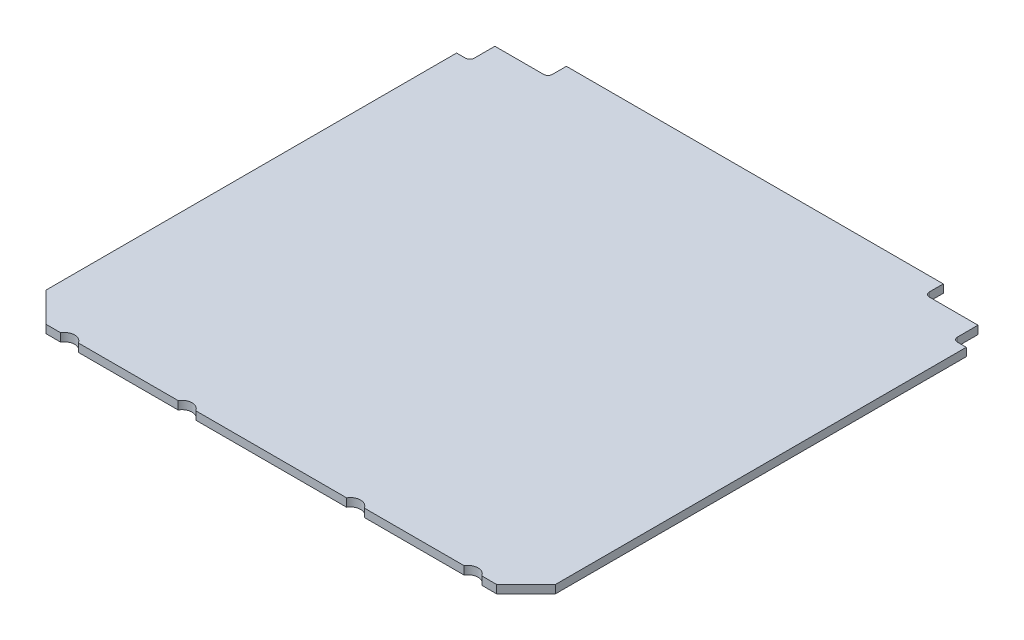
ISO-10303-21;
HEADER;
FILE_DESCRIPTION(('STEP AP214'),'2;1');
FILE_NAME('part.step','',(''),(''),'','','');
FILE_SCHEMA(('AUTOMOTIVE_DESIGN { 1 0 10303 214 1 1 1 1 }'));
ENDSEC;
DATA;
#1=APPLICATION_CONTEXT('core data for automotive mechanical design processes');
#2=APPLICATION_PROTOCOL_DEFINITION('international standard','automotive_design',2000,#1);
#3=PRODUCT_CONTEXT('',#1,'mechanical');
#4=PRODUCT('Part','Part','',(#3));
#5=PRODUCT_RELATED_PRODUCT_CATEGORY('part','',(#4));
#6=PRODUCT_DEFINITION_FORMATION('','',#4);
#7=PRODUCT_DEFINITION_CONTEXT('part definition',#1,'design');
#8=PRODUCT_DEFINITION('design','',#6,#7);
#9=PRODUCT_DEFINITION_SHAPE('','',#8);
#10=(LENGTH_UNIT() NAMED_UNIT(*) SI_UNIT(.MILLI.,.METRE.));
#11=(NAMED_UNIT(*) PLANE_ANGLE_UNIT() SI_UNIT($,.RADIAN.));
#12=(NAMED_UNIT(*) SI_UNIT($,.STERADIAN.) SOLID_ANGLE_UNIT());
#13=UNCERTAINTY_MEASURE_WITH_UNIT(LENGTH_MEASURE(1.E-05),#10,'distance_accuracy_value','');
#14=(GEOMETRIC_REPRESENTATION_CONTEXT(3) GLOBAL_UNCERTAINTY_ASSIGNED_CONTEXT((#13)) GLOBAL_UNIT_ASSIGNED_CONTEXT((#10,
#11,#12)) REPRESENTATION_CONTEXT('',''));
#15=CARTESIAN_POINT('',(0.,0.,0.));
#16=DIRECTION('',(0.,0.,1.));
#17=DIRECTION('',(1.,0.,0.));
#18=AXIS2_PLACEMENT_3D('',#15,#16,#17);
#19=CARTESIAN_POINT('',(44.4499999999995,0.8,44.4499999999995));
#20=DIRECTION('',(-0.707106781186548,0.,-0.707106781186548));
#21=DIRECTION('',(-0.707106781186548,0.,0.707106781186548));
#22=AXIS2_PLACEMENT_3D('',#19,#20,#21);
#23=PLANE('',#22);
#24=DIRECTION('',(0.,1.,0.));
#25=VECTOR('',#24,1.);
#26=CARTESIAN_POINT('',(44.0999999999991,-0.8,44.8));
#27=LINE('',#26,#25);
#28=CARTESIAN_POINT('',(44.0999999999991,-0.8,44.8));
#29=VERTEX_POINT('',#28);
#30=CARTESIAN_POINT('',(44.0999999999991,0.8,44.8));
#31=VERTEX_POINT('',#30);
#32=EDGE_CURVE('E228',#29,#31,#27,.T.);
#33=ORIENTED_EDGE('',*,*,#32,.F.);
#34=DIRECTION('',(0.707106781186548,0.,-0.707106781186548));
#35=VECTOR('',#34,1.);
#36=CARTESIAN_POINT('',(44.4499999999995,-0.8,44.4499999999995));
#37=LINE('',#36,#35);
#38=CARTESIAN_POINT('',(49.9000000000001,-0.8,38.999999999999));
#39=VERTEX_POINT('',#38);
#40=EDGE_CURVE('E244',#29,#39,#37,.T.);
#41=ORIENTED_EDGE('',*,*,#40,.T.);
#42=DIRECTION('',(0.,1.,0.));
#43=VECTOR('',#42,1.);
#44=CARTESIAN_POINT('',(49.9000000000001,-0.8,38.999999999999));
#45=LINE('',#44,#43);
#46=CARTESIAN_POINT('',(49.9000000000001,0.8,38.999999999999));
#47=VERTEX_POINT('',#46);
#48=EDGE_CURVE('E246',#39,#47,#45,.T.);
#49=ORIENTED_EDGE('',*,*,#48,.T.);
#50=DIRECTION('',(0.707106781186548,0.,-0.707106781186548));
#51=VECTOR('',#50,1.);
#52=CARTESIAN_POINT('',(44.4499999999995,0.8,44.4499999999995));
#53=LINE('',#52,#51);
#54=EDGE_CURVE('E236',#31,#47,#53,.T.);
#55=ORIENTED_EDGE('',*,*,#54,.F.);
#56=EDGE_LOOP('',(#33,#41,#49,#55));
#57=FACE_BOUND('',#56,.T.);
#58=ADVANCED_FACE('F38',(#57),#23,.F.);
#59=CARTESIAN_POINT('',(-44.4499999999997,0.8,44.4500000000004));
#60=DIRECTION('',(0.707106781186542,0.,-0.707106781186553));
#61=DIRECTION('',(-0.707106781186553,0.,-0.707106781186542));
#62=AXIS2_PLACEMENT_3D('',#59,#60,#61);
#63=PLANE('',#62);
#64=DIRECTION('',(0.,1.,0.));
#65=VECTOR('',#64,1.);
#66=CARTESIAN_POINT('',(-44.1000000000001,-0.8,44.8));
#67=LINE('',#66,#65);
#68=CARTESIAN_POINT('',(-44.1000000000001,-0.8,44.8));
#69=VERTEX_POINT('',#68);
#70=CARTESIAN_POINT('',(-44.1000000000001,0.8,44.8));
#71=VERTEX_POINT('',#70);
#72=EDGE_CURVE('E211',#69,#71,#67,.T.);
#73=ORIENTED_EDGE('',*,*,#72,.T.);
#74=DIRECTION('',(0.707106781186553,0.,0.707106781186542));
#75=VECTOR('',#74,1.);
#76=CARTESIAN_POINT('',(-44.4499999999997,0.8,44.4500000000004));
#77=LINE('',#76,#75);
#78=CARTESIAN_POINT('',(-49.9000000000001,0.8,39.));
#79=VERTEX_POINT('',#78);
#80=EDGE_CURVE('E225',#79,#71,#77,.T.);
#81=ORIENTED_EDGE('',*,*,#80,.F.);
#82=DIRECTION('',(0.,1.,0.));
#83=VECTOR('',#82,1.);
#84=CARTESIAN_POINT('',(-49.9000000000001,-0.8,39.));
#85=LINE('',#84,#83);
#86=CARTESIAN_POINT('',(-49.9000000000001,-0.8,39.));
#87=VERTEX_POINT('',#86);
#88=EDGE_CURVE('E341',#87,#79,#85,.T.);
#89=ORIENTED_EDGE('',*,*,#88,.F.);
#90=DIRECTION('',(0.707106781186553,0.,0.707106781186542));
#91=VECTOR('',#90,1.);
#92=CARTESIAN_POINT('',(-44.4499999999997,-0.8,44.4500000000004));
#93=LINE('',#92,#91);
#94=EDGE_CURVE('E227',#87,#69,#93,.T.);
#95=ORIENTED_EDGE('',*,*,#94,.T.);
#96=EDGE_LOOP('',(#73,#81,#89,#95));
#97=FACE_BOUND('',#96,.T.);
#98=ADVANCED_FACE('F223',(#97),#63,.F.);
#99=CARTESIAN_POINT('',(0.,0.8,0.));
#100=DIRECTION('',(0.,1.,0.));
#101=DIRECTION('',(0.,0.,1.));
#102=AXIS2_PLACEMENT_3D('',#99,#100,#101);
#103=PLANE('',#102);
#104=ORIENTED_EDGE('',*,*,#80,.T.);
#105=DIRECTION('',(1.,0.,0.));
#106=VECTOR('',#105,1.);
#107=CARTESIAN_POINT('',(0.,0.8,44.8));
#108=LINE('',#107,#106);
#109=CARTESIAN_POINT('',(-41.2320508075689,0.8,44.8));
#110=VERTEX_POINT('',#109);
#111=EDGE_CURVE('E208',#71,#110,#108,.T.);
#112=ORIENTED_EDGE('',*,*,#111,.T.);
#113=CARTESIAN_POINT('',(-39.5,0.8,45.8));
#114=DIRECTION('',(0.,1.,0.));
#115=DIRECTION('',(0.,0.,1.));
#116=AXIS2_PLACEMENT_3D('',#113,#114,#115);
#117=CIRCLE('',#116,2.);
#118=CARTESIAN_POINT('',(-37.7679491924311,0.8,44.8));
#119=VERTEX_POINT('',#118);
#120=EDGE_CURVE('E365',#119,#110,#117,.T.);
#121=ORIENTED_EDGE('',*,*,#120,.F.);
#122=DIRECTION('',(1.,0.,0.));
#123=VECTOR('',#122,1.);
#124=CARTESIAN_POINT('',(0.,0.8,44.8));
#125=LINE('',#124,#123);
#126=CARTESIAN_POINT('',(-18.2320508075689,0.8,44.8));
#127=VERTEX_POINT('',#126);
#128=EDGE_CURVE('E369',#119,#127,#125,.T.);
#129=ORIENTED_EDGE('',*,*,#128,.T.);
#130=CARTESIAN_POINT('',(-16.5,0.8,45.8));
#131=DIRECTION('',(0.,1.,0.));
#132=DIRECTION('',(0.,0.,1.));
#133=AXIS2_PLACEMENT_3D('',#130,#131,#132);
#134=CIRCLE('',#133,2.);
#135=CARTESIAN_POINT('',(-14.7679491924311,0.8,44.8));
#136=VERTEX_POINT('',#135);
#137=EDGE_CURVE('E503',#136,#127,#134,.T.);
#138=ORIENTED_EDGE('',*,*,#137,.F.);
#139=DIRECTION('',(1.,0.,0.));
#140=VECTOR('',#139,1.);
#141=CARTESIAN_POINT('',(0.,0.8,44.8));
#142=LINE('',#141,#140);
#143=CARTESIAN_POINT('',(14.7679491924311,0.8,44.8));
#144=VERTEX_POINT('',#143);
#145=EDGE_CURVE('E500',#136,#144,#142,.T.);
#146=ORIENTED_EDGE('',*,*,#145,.T.);
#147=CARTESIAN_POINT('',(16.5,0.8,45.8));
#148=DIRECTION('',(0.,1.,0.));
#149=DIRECTION('',(0.,0.,1.));
#150=AXIS2_PLACEMENT_3D('',#147,#148,#149);
#151=CIRCLE('',#150,2.);
#152=CARTESIAN_POINT('',(18.2320508075689,0.8,44.8));
#153=VERTEX_POINT('',#152);
#154=EDGE_CURVE('E497',#153,#144,#151,.T.);
#155=ORIENTED_EDGE('',*,*,#154,.F.);
#156=DIRECTION('',(1.,0.,0.));
#157=VECTOR('',#156,1.);
#158=CARTESIAN_POINT('',(0.,0.8,44.8));
#159=LINE('',#158,#157);
#160=CARTESIAN_POINT('',(37.7679491924311,0.8,44.8));
#161=VERTEX_POINT('',#160);
#162=EDGE_CURVE('E493',#153,#161,#159,.T.);
#163=ORIENTED_EDGE('',*,*,#162,.T.);
#164=CARTESIAN_POINT('',(39.5,0.8,45.8));
#165=DIRECTION('',(0.,1.,0.));
#166=DIRECTION('',(0.,0.,1.));
#167=AXIS2_PLACEMENT_3D('',#164,#165,#166);
#168=CIRCLE('',#167,2.);
#169=CARTESIAN_POINT('',(41.2320508075689,0.8,44.8));
#170=VERTEX_POINT('',#169);
#171=EDGE_CURVE('E491',#170,#161,#168,.T.);
#172=ORIENTED_EDGE('',*,*,#171,.F.);
#173=DIRECTION('',(1.,0.,0.));
#174=VECTOR('',#173,1.);
#175=CARTESIAN_POINT('',(0.,0.8,44.8));
#176=LINE('',#175,#174);
#177=EDGE_CURVE('E218',#170,#31,#176,.T.);
#178=ORIENTED_EDGE('',*,*,#177,.T.);
#179=ORIENTED_EDGE('',*,*,#54,.T.);
#180=DIRECTION('',(0.,0.,-1.));
#181=VECTOR('',#180,1.);
#182=CARTESIAN_POINT('',(49.9000000000001,0.8,0.));
#183=LINE('',#182,#181);
#184=CARTESIAN_POINT('',(49.9000000000001,0.8,-41.4000000000031));
#185=VERTEX_POINT('',#184);
#186=EDGE_CURVE('E317',#47,#185,#183,.T.);
#187=ORIENTED_EDGE('',*,*,#186,.T.);
#188=DIRECTION('',(-1.,0.,0.));
#189=VECTOR('',#188,1.);
#190=CARTESIAN_POINT('',(0.,0.8,-41.4000000000031));
#191=LINE('',#190,#189);
#192=CARTESIAN_POINT('',(48.1635999999999,0.8,-41.4000000000031));
#193=VERTEX_POINT('',#192);
#194=EDGE_CURVE('E315',#185,#193,#191,.T.);
#195=ORIENTED_EDGE('',*,*,#194,.T.);
#196=CARTESIAN_POINT('',(48.1635999999999,0.8,-42.2636000000031));
#197=DIRECTION('',(0.,1.,0.));
#198=DIRECTION('',(0.,0.,1.));
#199=AXIS2_PLACEMENT_3D('',#196,#197,#198);
#200=CIRCLE('',#199,0.8636);
#201=CARTESIAN_POINT('',(47.2999999999999,0.8,-42.2636000000031));
#202=VERTEX_POINT('',#201);
#203=EDGE_CURVE('E46',#193,#202,#200,.F.);
#204=ORIENTED_EDGE('',*,*,#203,.T.);
#205=DIRECTION('',(0.,0.,-1.));
#206=VECTOR('',#205,1.);
#207=CARTESIAN_POINT('',(47.2999999999999,0.8,0.));
#208=LINE('',#207,#206);
#209=CARTESIAN_POINT('',(47.2999999999999,0.8,-46.3));
#210=VERTEX_POINT('',#209);
#211=EDGE_CURVE('E308',#202,#210,#208,.T.);
#212=ORIENTED_EDGE('',*,*,#211,.T.);
#213=DIRECTION('',(-1.,0.,0.));
#214=VECTOR('',#213,1.);
#215=CARTESIAN_POINT('',(0.,0.8,-46.3));
#216=LINE('',#215,#214);
#217=CARTESIAN_POINT('',(37.7635999999997,0.8,-46.3));
#218=VERTEX_POINT('',#217);
#219=EDGE_CURVE('E300',#210,#218,#216,.T.);
#220=ORIENTED_EDGE('',*,*,#219,.T.);
#221=CARTESIAN_POINT('',(37.7635999999997,0.8,-47.1636));
#222=DIRECTION('',(0.,1.,0.));
#223=DIRECTION('',(0.,0.,1.));
#224=AXIS2_PLACEMENT_3D('',#221,#222,#223);
#225=CIRCLE('',#224,0.8636);
#226=CARTESIAN_POINT('',(36.8999999999997,0.8,-47.1636));
#227=VERTEX_POINT('',#226);
#228=EDGE_CURVE('E271',#218,#227,#225,.F.);
#229=ORIENTED_EDGE('',*,*,#228,.T.);
#230=DIRECTION('',(0.,0.,-1.));
#231=VECTOR('',#230,1.);
#232=CARTESIAN_POINT('',(36.8999999999973,0.8,1.92033888790618E-12));
#233=LINE('',#232,#231);
#234=CARTESIAN_POINT('',(36.8999999999999,0.8,-49.9));
#235=VERTEX_POINT('',#234);
#236=EDGE_CURVE('E298',#227,#235,#233,.T.);
#237=ORIENTED_EDGE('',*,*,#236,.T.);
#238=DIRECTION('',(-1.,0.,0.));
#239=VECTOR('',#238,1.);
#240=CARTESIAN_POINT('',(0.,0.8,-49.9));
#241=LINE('',#240,#239);
#242=CARTESIAN_POINT('',(-36.9000000000002,0.8,-49.9));
#243=VERTEX_POINT('',#242);
#244=EDGE_CURVE('E306',#235,#243,#241,.T.);
#245=ORIENTED_EDGE('',*,*,#244,.T.);
#246=DIRECTION('',(0.,0.,1.));
#247=VECTOR('',#246,1.);
#248=CARTESIAN_POINT('',(-36.8999999999999,0.8,2.13370987545147E-13));
#249=LINE('',#248,#247);
#250=CARTESIAN_POINT('',(-36.9000000000002,0.8,-47.1636));
#251=VERTEX_POINT('',#250);
#252=EDGE_CURVE('E310',#243,#251,#249,.T.);
#253=ORIENTED_EDGE('',*,*,#252,.T.);
#254=CARTESIAN_POINT('',(-37.7636000000002,0.8,-47.1636));
#255=DIRECTION('',(0.,1.,0.));
#256=DIRECTION('',(0.,0.,1.));
#257=AXIS2_PLACEMENT_3D('',#254,#255,#256);
#258=CIRCLE('',#257,0.8636);
#259=CARTESIAN_POINT('',(-37.7636000000002,0.8,-46.3));
#260=VERTEX_POINT('',#259);
#261=EDGE_CURVE('E267',#251,#260,#258,.F.);
#262=ORIENTED_EDGE('',*,*,#261,.T.);
#263=DIRECTION('',(-1.,0.,0.));
#264=VECTOR('',#263,1.);
#265=CARTESIAN_POINT('',(0.,0.8,-46.3));
#266=LINE('',#265,#264);
#267=CARTESIAN_POINT('',(-47.3000000000002,0.8,-46.3));
#268=VERTEX_POINT('',#267);
#269=EDGE_CURVE('E410',#260,#268,#266,.T.);
#270=ORIENTED_EDGE('',*,*,#269,.T.);
#271=DIRECTION('',(0.,0.,1.));
#272=VECTOR('',#271,1.);
#273=CARTESIAN_POINT('',(-47.3000000000002,0.8,0.));
#274=LINE('',#273,#272);
#275=CARTESIAN_POINT('',(-47.3000000000002,0.8,-42.2636));
#276=VERTEX_POINT('',#275);
#277=EDGE_CURVE('E407',#268,#276,#274,.T.);
#278=ORIENTED_EDGE('',*,*,#277,.T.);
#279=CARTESIAN_POINT('',(-48.1636000000002,0.8,-42.2636));
#280=DIRECTION('',(0.,1.,0.));
#281=DIRECTION('',(0.,0.,1.));
#282=AXIS2_PLACEMENT_3D('',#279,#280,#281);
#283=CIRCLE('',#282,0.8636);
#284=CARTESIAN_POINT('',(-48.1636000000002,0.8,-41.4));
#285=VERTEX_POINT('',#284);
#286=EDGE_CURVE('E263',#276,#285,#283,.F.);
#287=ORIENTED_EDGE('',*,*,#286,.T.);
#288=DIRECTION('',(-1.,0.,0.));
#289=VECTOR('',#288,1.);
#290=CARTESIAN_POINT('',(1.10488541392987E-12,0.8,-41.3999999999987));
#291=LINE('',#290,#289);
#292=CARTESIAN_POINT('',(-49.9000000000001,0.8,-41.4000000000001));
#293=VERTEX_POINT('',#292);
#294=EDGE_CURVE('E405',#285,#293,#291,.T.);
#295=ORIENTED_EDGE('',*,*,#294,.T.);
#296=DIRECTION('',(0.,0.,1.));
#297=VECTOR('',#296,1.);
#298=CARTESIAN_POINT('',(-49.9000000000001,0.8,0.));
#299=LINE('',#298,#297);
#300=EDGE_CURVE('E234',#293,#79,#299,.T.);
#301=ORIENTED_EDGE('',*,*,#300,.T.);
#302=EDGE_LOOP('',(#104,#112,#121,#129,#138,#146,#155,#163,#172,#178,#179,#187,#195,#204,#212,
#220,#229,#237,#245,#253,#262,#270,#278,#287,#295,#301));
#303=FACE_BOUND('',#302,.T.);
#304=ADVANCED_FACE('F232',(#303),#103,.T.);
#305=CARTESIAN_POINT('',(0.,-0.8,0.));
#306=DIRECTION('',(0.,1.,0.));
#307=DIRECTION('',(0.,0.,1.));
#308=AXIS2_PLACEMENT_3D('',#305,#306,#307);
#309=PLANE('',#308);
#310=DIRECTION('',(1.,0.,0.));
#311=VECTOR('',#310,1.);
#312=CARTESIAN_POINT('',(0.,-0.8,44.8));
#313=LINE('',#312,#311);
#314=CARTESIAN_POINT('',(-41.2320508075689,-0.8,44.8));
#315=VERTEX_POINT('',#314);
#316=EDGE_CURVE('E361',#69,#315,#313,.T.);
#317=ORIENTED_EDGE('',*,*,#316,.F.);
#318=ORIENTED_EDGE('',*,*,#94,.F.);
#319=DIRECTION('',(0.,0.,1.));
#320=VECTOR('',#319,1.);
#321=CARTESIAN_POINT('',(-49.9000000000001,-0.8,0.));
#322=LINE('',#321,#320);
#323=CARTESIAN_POINT('',(-49.9000000000001,-0.8,-41.4000000000001));
#324=VERTEX_POINT('',#323);
#325=EDGE_CURVE('E320',#324,#87,#322,.T.);
#326=ORIENTED_EDGE('',*,*,#325,.F.);
#327=DIRECTION('',(-1.,0.,0.));
#328=VECTOR('',#327,1.);
#329=CARTESIAN_POINT('',(1.10488541392987E-12,-0.8,-41.3999999999987));
#330=LINE('',#329,#328);
#331=CARTESIAN_POINT('',(-48.1636000000002,-0.8,-41.4));
#332=VERTEX_POINT('',#331);
#333=EDGE_CURVE('E322',#332,#324,#330,.T.);
#334=ORIENTED_EDGE('',*,*,#333,.F.);
#335=CARTESIAN_POINT('',(-48.1636000000002,-0.8,-42.2636));
#336=DIRECTION('',(0.,1.,0.));
#337=DIRECTION('',(0.,0.,1.));
#338=AXIS2_PLACEMENT_3D('',#335,#336,#337);
#339=CIRCLE('',#338,0.8636);
#340=CARTESIAN_POINT('',(-47.3000000000002,-0.8,-42.2636));
#341=VERTEX_POINT('',#340);
#342=EDGE_CURVE('E265',#332,#341,#339,.T.);
#343=ORIENTED_EDGE('',*,*,#342,.T.);
#344=DIRECTION('',(0.,0.,1.));
#345=VECTOR('',#344,1.);
#346=CARTESIAN_POINT('',(-47.3000000000002,-0.8,0.));
#347=LINE('',#346,#345);
#348=CARTESIAN_POINT('',(-47.3000000000002,-0.8,-46.3));
#349=VERTEX_POINT('',#348);
#350=EDGE_CURVE('E324',#349,#341,#347,.T.);
#351=ORIENTED_EDGE('',*,*,#350,.F.);
#352=DIRECTION('',(-1.,0.,0.));
#353=VECTOR('',#352,1.);
#354=CARTESIAN_POINT('',(0.,-0.8,-46.3));
#355=LINE('',#354,#353);
#356=CARTESIAN_POINT('',(-37.7636000000002,-0.8,-46.3));
#357=VERTEX_POINT('',#356);
#358=EDGE_CURVE('E327',#357,#349,#355,.T.);
#359=ORIENTED_EDGE('',*,*,#358,.F.);
#360=CARTESIAN_POINT('',(-37.7636000000002,-0.8,-47.1636));
#361=DIRECTION('',(0.,1.,0.));
#362=DIRECTION('',(0.,0.,1.));
#363=AXIS2_PLACEMENT_3D('',#360,#361,#362);
#364=CIRCLE('',#363,0.8636);
#365=CARTESIAN_POINT('',(-36.9000000000002,-0.8,-47.1636));
#366=VERTEX_POINT('',#365);
#367=EDGE_CURVE('E269',#357,#366,#364,.T.);
#368=ORIENTED_EDGE('',*,*,#367,.T.);
#369=DIRECTION('',(0.,0.,1.));
#370=VECTOR('',#369,1.);
#371=CARTESIAN_POINT('',(-36.8999999999999,-0.8,2.13370987545147E-13));
#372=LINE('',#371,#370);
#373=CARTESIAN_POINT('',(-36.9000000000002,-0.8,-49.9));
#374=VERTEX_POINT('',#373);
#375=EDGE_CURVE('E329',#374,#366,#372,.T.);
#376=ORIENTED_EDGE('',*,*,#375,.F.);
#377=DIRECTION('',(-1.,0.,0.));
#378=VECTOR('',#377,1.);
#379=CARTESIAN_POINT('',(0.,-0.8,-49.9));
#380=LINE('',#379,#378);
#381=CARTESIAN_POINT('',(36.8999999999999,-0.8,-49.9));
#382=VERTEX_POINT('',#381);
#383=EDGE_CURVE('E332',#382,#374,#380,.T.);
#384=ORIENTED_EDGE('',*,*,#383,.F.);
#385=DIRECTION('',(0.,0.,-1.));
#386=VECTOR('',#385,1.);
#387=CARTESIAN_POINT('',(36.8999999999973,-0.8,1.92033888790618E-12));
#388=LINE('',#387,#386);
#389=CARTESIAN_POINT('',(36.8999999999997,-0.8,-47.1636));
#390=VERTEX_POINT('',#389);
#391=EDGE_CURVE('E282',#390,#382,#388,.T.);
#392=ORIENTED_EDGE('',*,*,#391,.F.);
#393=CARTESIAN_POINT('',(37.7635999999997,-0.8,-47.1636));
#394=DIRECTION('',(0.,1.,0.));
#395=DIRECTION('',(0.,0.,1.));
#396=AXIS2_PLACEMENT_3D('',#393,#394,#395);
#397=CIRCLE('',#396,0.8636);
#398=CARTESIAN_POINT('',(37.7635999999997,-0.8,-46.3));
#399=VERTEX_POINT('',#398);
#400=EDGE_CURVE('E273',#390,#399,#397,.T.);
#401=ORIENTED_EDGE('',*,*,#400,.T.);
#402=DIRECTION('',(-1.,0.,0.));
#403=VECTOR('',#402,1.);
#404=CARTESIAN_POINT('',(0.,-0.8,-46.3));
#405=LINE('',#404,#403);
#406=CARTESIAN_POINT('',(47.2999999999999,-0.8,-46.3));
#407=VERTEX_POINT('',#406);
#408=EDGE_CURVE('E280',#407,#399,#405,.T.);
#409=ORIENTED_EDGE('',*,*,#408,.F.);
#410=DIRECTION('',(0.,0.,-1.));
#411=VECTOR('',#410,1.);
#412=CARTESIAN_POINT('',(47.2999999999999,-0.8,0.));
#413=LINE('',#412,#411);
#414=CARTESIAN_POINT('',(47.2999999999999,-0.8,-42.2636000000031));
#415=VERTEX_POINT('',#414);
#416=EDGE_CURVE('E293',#415,#407,#413,.T.);
#417=ORIENTED_EDGE('',*,*,#416,.F.);
#418=CARTESIAN_POINT('',(48.1635999999999,-0.8,-42.2636000000031));
#419=DIRECTION('',(0.,1.,0.));
#420=DIRECTION('',(0.,0.,1.));
#421=AXIS2_PLACEMENT_3D('',#418,#419,#420);
#422=CIRCLE('',#421,0.8636);
#423=CARTESIAN_POINT('',(48.1635999999999,-0.8,-41.4000000000031));
#424=VERTEX_POINT('',#423);
#425=EDGE_CURVE('E11',#415,#424,#422,.T.);
#426=ORIENTED_EDGE('',*,*,#425,.T.);
#427=DIRECTION('',(-1.,0.,0.));
#428=VECTOR('',#427,1.);
#429=CARTESIAN_POINT('',(0.,-0.8,-41.4000000000031));
#430=LINE('',#429,#428);
#431=CARTESIAN_POINT('',(49.9000000000001,-0.8,-41.4000000000031));
#432=VERTEX_POINT('',#431);
#433=EDGE_CURVE('E336',#432,#424,#430,.T.);
#434=ORIENTED_EDGE('',*,*,#433,.F.);
#435=DIRECTION('',(0.,0.,-1.));
#436=VECTOR('',#435,1.);
#437=CARTESIAN_POINT('',(49.9000000000001,-0.8,0.));
#438=LINE('',#437,#436);
#439=EDGE_CURVE('E339',#39,#432,#438,.T.);
#440=ORIENTED_EDGE('',*,*,#439,.F.);
#441=ORIENTED_EDGE('',*,*,#40,.F.);
#442=DIRECTION('',(1.,0.,0.));
#443=VECTOR('',#442,1.);
#444=CARTESIAN_POINT('',(0.,-0.8,44.8));
#445=LINE('',#444,#443);
#446=CARTESIAN_POINT('',(41.2320508075689,-0.8,44.8));
#447=VERTEX_POINT('',#446);
#448=EDGE_CURVE('E364',#447,#29,#445,.T.);
#449=ORIENTED_EDGE('',*,*,#448,.F.);
#450=CARTESIAN_POINT('',(39.5,-0.8,45.8));
#451=DIRECTION('',(0.,1.,0.));
#452=DIRECTION('',(0.,0.,1.));
#453=AXIS2_PLACEMENT_3D('',#450,#451,#452);
#454=CIRCLE('',#453,2.);
#455=CARTESIAN_POINT('',(37.7679491924311,-0.8,44.8));
#456=VERTEX_POINT('',#455);
#457=EDGE_CURVE('E367',#447,#456,#454,.T.);
#458=ORIENTED_EDGE('',*,*,#457,.T.);
#459=DIRECTION('',(1.,0.,0.));
#460=VECTOR('',#459,1.);
#461=CARTESIAN_POINT('',(0.,-0.8,44.8));
#462=LINE('',#461,#460);
#463=CARTESIAN_POINT('',(18.2320508075689,-0.8,44.8));
#464=VERTEX_POINT('',#463);
#465=EDGE_CURVE('E375',#464,#456,#462,.T.);
#466=ORIENTED_EDGE('',*,*,#465,.F.);
#467=CARTESIAN_POINT('',(16.5,-0.8,45.8));
#468=DIRECTION('',(0.,1.,0.));
#469=DIRECTION('',(0.,0.,1.));
#470=AXIS2_PLACEMENT_3D('',#467,#468,#469);
#471=CIRCLE('',#470,2.);
#472=CARTESIAN_POINT('',(14.7679491924311,-0.8,44.8));
#473=VERTEX_POINT('',#472);
#474=EDGE_CURVE('E377',#464,#473,#471,.T.);
#475=ORIENTED_EDGE('',*,*,#474,.T.);
#476=DIRECTION('',(1.,0.,0.));
#477=VECTOR('',#476,1.);
#478=CARTESIAN_POINT('',(0.,-0.8,44.8));
#479=LINE('',#478,#477);
#480=CARTESIAN_POINT('',(-14.7679491924311,-0.8,44.8));
#481=VERTEX_POINT('',#480);
#482=EDGE_CURVE('E380',#481,#473,#479,.T.);
#483=ORIENTED_EDGE('',*,*,#482,.F.);
#484=CARTESIAN_POINT('',(-16.5,-0.8,45.8));
#485=DIRECTION('',(0.,1.,0.));
#486=DIRECTION('',(0.,0.,1.));
#487=AXIS2_PLACEMENT_3D('',#484,#485,#486);
#488=CIRCLE('',#487,2.);
#489=CARTESIAN_POINT('',(-18.2320508075689,-0.8,44.8));
#490=VERTEX_POINT('',#489);
#491=EDGE_CURVE('E382',#481,#490,#488,.T.);
#492=ORIENTED_EDGE('',*,*,#491,.T.);
#493=DIRECTION('',(1.,0.,0.));
#494=VECTOR('',#493,1.);
#495=CARTESIAN_POINT('',(0.,-0.8,44.8));
#496=LINE('',#495,#494);
#497=CARTESIAN_POINT('',(-37.7679491924311,-0.8,44.8));
#498=VERTEX_POINT('',#497);
#499=EDGE_CURVE('E385',#498,#490,#496,.T.);
#500=ORIENTED_EDGE('',*,*,#499,.F.);
#501=CARTESIAN_POINT('',(-39.5,-0.8,45.8));
#502=DIRECTION('',(0.,1.,0.));
#503=DIRECTION('',(0.,0.,1.));
#504=AXIS2_PLACEMENT_3D('',#501,#502,#503);
#505=CIRCLE('',#504,2.);
#506=EDGE_CURVE('E229',#498,#315,#505,.T.);
#507=ORIENTED_EDGE('',*,*,#506,.T.);
#508=EDGE_LOOP('',(#317,#318,#326,#334,#343,#351,#359,#368,#376,#384,#392,#401,#409,#417,#426,
#434,#440,#441,#449,#458,#466,#475,#483,#492,#500,#507));
#509=FACE_BOUND('',#508,.T.);
#510=ADVANCED_FACE('F279',(#509),#309,.F.);
#511=CARTESIAN_POINT('',(49.9000000000001,-0.8,0.));
#512=DIRECTION('',(1.,0.,0.));
#513=DIRECTION('',(0.,0.,-1.));
#514=AXIS2_PLACEMENT_3D('',#511,#512,#513);
#515=PLANE('',#514);
#516=ORIENTED_EDGE('',*,*,#48,.F.);
#517=ORIENTED_EDGE('',*,*,#439,.T.);
#518=DIRECTION('',(0.,1.,0.));
#519=VECTOR('',#518,1.);
#520=CARTESIAN_POINT('',(49.9000000000001,-0.8,-41.4000000000031));
#521=LINE('',#520,#519);
#522=EDGE_CURVE('E344',#432,#185,#521,.T.);
#523=ORIENTED_EDGE('',*,*,#522,.T.);
#524=ORIENTED_EDGE('',*,*,#186,.F.);
#525=EDGE_LOOP('',(#516,#517,#523,#524));
#526=FACE_BOUND('',#525,.T.);
#527=ADVANCED_FACE('F480',(#526),#515,.T.);
#528=CARTESIAN_POINT('',(0.,-0.8,-41.4000000000031));
#529=DIRECTION('',(0.,0.,-1.));
#530=DIRECTION('',(-1.,0.,0.));
#531=AXIS2_PLACEMENT_3D('',#528,#529,#530);
#532=PLANE('',#531);
#533=ORIENTED_EDGE('',*,*,#433,.T.);
#534=DIRECTION('',(0.,1.,0.));
#535=VECTOR('',#534,1.);
#536=CARTESIAN_POINT('',(48.1635999999999,0.8,-41.4000000000031));
#537=LINE('',#536,#535);
#538=EDGE_CURVE('E259',#424,#193,#537,.T.);
#539=ORIENTED_EDGE('',*,*,#538,.T.);
#540=ORIENTED_EDGE('',*,*,#194,.F.);
#541=ORIENTED_EDGE('',*,*,#522,.F.);
#542=EDGE_LOOP('',(#533,#539,#540,#541));
#543=FACE_BOUND('',#542,.T.);
#544=ADVANCED_FACE('F475',(#543),#532,.T.);
#545=CARTESIAN_POINT('',(47.2999999999999,-0.8,0.));
#546=DIRECTION('',(1.,0.,0.));
#547=DIRECTION('',(0.,0.,-1.));
#548=AXIS2_PLACEMENT_3D('',#545,#546,#547);
#549=PLANE('',#548);
#550=ORIENTED_EDGE('',*,*,#211,.F.);
#551=DIRECTION('',(0.,1.,0.));
#552=VECTOR('',#551,1.);
#553=CARTESIAN_POINT('',(47.2999999999999,-0.8,-42.2636000000031));
#554=LINE('',#553,#552);
#555=EDGE_CURVE('E59',#202,#415,#554,.F.);
#556=ORIENTED_EDGE('',*,*,#555,.T.);
#557=ORIENTED_EDGE('',*,*,#416,.T.);
#558=DIRECTION('',(0.,1.,0.));
#559=VECTOR('',#558,1.);
#560=CARTESIAN_POINT('',(47.2999999999999,-0.8,-46.3));
#561=LINE('',#560,#559);
#562=EDGE_CURVE('E292',#407,#210,#561,.T.);
#563=ORIENTED_EDGE('',*,*,#562,.T.);
#564=EDGE_LOOP('',(#550,#556,#557,#563));
#565=FACE_BOUND('',#564,.T.);
#566=ADVANCED_FACE('F547',(#565),#549,.T.);
#567=CARTESIAN_POINT('',(0.,-0.8,-46.3));
#568=DIRECTION('',(0.,0.,-1.));
#569=DIRECTION('',(-1.,0.,0.));
#570=AXIS2_PLACEMENT_3D('',#567,#568,#569);
#571=PLANE('',#570);
#572=ORIENTED_EDGE('',*,*,#408,.T.);
#573=DIRECTION('',(0.,1.,0.));
#574=VECTOR('',#573,1.);
#575=CARTESIAN_POINT('',(37.7635999999997,0.8,-46.3));
#576=LINE('',#575,#574);
#577=EDGE_CURVE('E254',#399,#218,#576,.T.);
#578=ORIENTED_EDGE('',*,*,#577,.T.);
#579=ORIENTED_EDGE('',*,*,#219,.F.);
#580=ORIENTED_EDGE('',*,*,#562,.F.);
#581=EDGE_LOOP('',(#572,#578,#579,#580));
#582=FACE_BOUND('',#581,.T.);
#583=ADVANCED_FACE('F288',(#582),#571,.T.);
#584=CARTESIAN_POINT('',(36.8999999999973,-0.8,1.92033888790618E-12));
#585=DIRECTION('',(1.,0.,0.));
#586=DIRECTION('',(0.,0.,-1.));
#587=AXIS2_PLACEMENT_3D('',#584,#585,#586);
#588=PLANE('',#587);
#589=ORIENTED_EDGE('',*,*,#236,.F.);
#590=DIRECTION('',(0.,1.,0.));
#591=VECTOR('',#590,1.);
#592=CARTESIAN_POINT('',(36.8999999999997,-0.8,-47.1636));
#593=LINE('',#592,#591);
#594=EDGE_CURVE('E257',#227,#390,#593,.F.);
#595=ORIENTED_EDGE('',*,*,#594,.T.);
#596=ORIENTED_EDGE('',*,*,#391,.T.);
#597=DIRECTION('',(0.,1.,0.));
#598=VECTOR('',#597,1.);
#599=CARTESIAN_POINT('',(36.8999999999999,-0.8,-49.9));
#600=LINE('',#599,#598);
#601=EDGE_CURVE('E304',#382,#235,#600,.T.);
#602=ORIENTED_EDGE('',*,*,#601,.T.);
#603=EDGE_LOOP('',(#589,#595,#596,#602));
#604=FACE_BOUND('',#603,.T.);
#605=ADVANCED_FACE('F302',(#604),#588,.T.);
#606=CARTESIAN_POINT('',(0.,-0.8,-49.9));
#607=DIRECTION('',(0.,0.,-1.));
#608=DIRECTION('',(-1.,0.,0.));
#609=AXIS2_PLACEMENT_3D('',#606,#607,#608);
#610=PLANE('',#609);
#611=ORIENTED_EDGE('',*,*,#601,.F.);
#612=ORIENTED_EDGE('',*,*,#383,.T.);
#613=DIRECTION('',(0.,1.,0.));
#614=VECTOR('',#613,1.);
#615=CARTESIAN_POINT('',(-36.9000000000002,-0.8,-49.9));
#616=LINE('',#615,#614);
#617=EDGE_CURVE('E348',#374,#243,#616,.T.);
#618=ORIENTED_EDGE('',*,*,#617,.T.);
#619=ORIENTED_EDGE('',*,*,#244,.F.);
#620=EDGE_LOOP('',(#611,#612,#618,#619));
#621=FACE_BOUND('',#620,.T.);
#622=ADVANCED_FACE('F554',(#621),#610,.T.);
#623=CARTESIAN_POINT('',(-36.8999999999999,-0.8,2.13370987545147E-13));
#624=DIRECTION('',(-1.,0.,0.));
#625=DIRECTION('',(0.,0.,1.));
#626=AXIS2_PLACEMENT_3D('',#623,#624,#625);
#627=PLANE('',#626);
#628=ORIENTED_EDGE('',*,*,#375,.T.);
#629=DIRECTION('',(0.,1.,0.));
#630=VECTOR('',#629,1.);
#631=CARTESIAN_POINT('',(-36.9000000000002,0.8,-47.1636));
#632=LINE('',#631,#630);
#633=EDGE_CURVE('E249',#366,#251,#632,.T.);
#634=ORIENTED_EDGE('',*,*,#633,.T.);
#635=ORIENTED_EDGE('',*,*,#252,.F.);
#636=ORIENTED_EDGE('',*,*,#617,.F.);
#637=EDGE_LOOP('',(#628,#634,#635,#636));
#638=FACE_BOUND('',#637,.T.);
#639=ADVANCED_FACE('F416',(#638),#627,.T.);
#640=CARTESIAN_POINT('',(0.,-0.8,-46.3));
#641=DIRECTION('',(0.,0.,-1.));
#642=DIRECTION('',(-1.,0.,0.));
#643=AXIS2_PLACEMENT_3D('',#640,#641,#642);
#644=PLANE('',#643);
#645=ORIENTED_EDGE('',*,*,#269,.F.);
#646=DIRECTION('',(0.,1.,0.));
#647=VECTOR('',#646,1.);
#648=CARTESIAN_POINT('',(-37.7636000000002,-0.8,-46.3));
#649=LINE('',#648,#647);
#650=EDGE_CURVE('E252',#260,#357,#649,.F.);
#651=ORIENTED_EDGE('',*,*,#650,.T.);
#652=ORIENTED_EDGE('',*,*,#358,.T.);
#653=DIRECTION('',(0.,1.,0.));
#654=VECTOR('',#653,1.);
#655=CARTESIAN_POINT('',(-47.3000000000002,-0.8,-46.3));
#656=LINE('',#655,#654);
#657=EDGE_CURVE('E350',#349,#268,#656,.T.);
#658=ORIENTED_EDGE('',*,*,#657,.T.);
#659=EDGE_LOOP('',(#645,#651,#652,#658));
#660=FACE_BOUND('',#659,.T.);
#661=ADVANCED_FACE('F425',(#660),#644,.T.);
#662=CARTESIAN_POINT('',(-47.3000000000002,-0.8,0.));
#663=DIRECTION('',(-1.,0.,0.));
#664=DIRECTION('',(0.,0.,1.));
#665=AXIS2_PLACEMENT_3D('',#662,#663,#664);
#666=PLANE('',#665);
#667=ORIENTED_EDGE('',*,*,#350,.T.);
#668=DIRECTION('',(0.,1.,0.));
#669=VECTOR('',#668,1.);
#670=CARTESIAN_POINT('',(-47.3000000000002,0.8,-42.2636));
#671=LINE('',#670,#669);
#672=EDGE_CURVE('E235',#341,#276,#671,.T.);
#673=ORIENTED_EDGE('',*,*,#672,.T.);
#674=ORIENTED_EDGE('',*,*,#277,.F.);
#675=ORIENTED_EDGE('',*,*,#657,.F.);
#676=EDGE_LOOP('',(#667,#673,#674,#675));
#677=FACE_BOUND('',#676,.T.);
#678=ADVANCED_FACE('F431',(#677),#666,.T.);
#679=CARTESIAN_POINT('',(1.10488541392987E-12,-0.8,-41.3999999999987));
#680=DIRECTION('',(0.,0.,-1.));
#681=DIRECTION('',(-1.,0.,0.));
#682=AXIS2_PLACEMENT_3D('',#679,#680,#681);
#683=PLANE('',#682);
#684=ORIENTED_EDGE('',*,*,#294,.F.);
#685=DIRECTION('',(0.,1.,0.));
#686=VECTOR('',#685,1.);
#687=CARTESIAN_POINT('',(-48.1636000000002,-0.8,-41.4));
#688=LINE('',#687,#686);
#689=EDGE_CURVE('E239',#285,#332,#688,.F.);
#690=ORIENTED_EDGE('',*,*,#689,.T.);
#691=ORIENTED_EDGE('',*,*,#333,.T.);
#692=DIRECTION('',(0.,1.,0.));
#693=VECTOR('',#692,1.);
#694=CARTESIAN_POINT('',(-49.9000000000001,-0.8,-41.4000000000001));
#695=LINE('',#694,#693);
#696=EDGE_CURVE('E353',#324,#293,#695,.T.);
#697=ORIENTED_EDGE('',*,*,#696,.T.);
#698=EDGE_LOOP('',(#684,#690,#691,#697));
#699=FACE_BOUND('',#698,.T.);
#700=ADVANCED_FACE('F438',(#699),#683,.T.);
#701=CARTESIAN_POINT('',(-49.9000000000001,-0.8,0.));
#702=DIRECTION('',(-1.,0.,0.));
#703=DIRECTION('',(0.,0.,1.));
#704=AXIS2_PLACEMENT_3D('',#701,#702,#703);
#705=PLANE('',#704);
#706=ORIENTED_EDGE('',*,*,#696,.F.);
#707=ORIENTED_EDGE('',*,*,#325,.T.);
#708=ORIENTED_EDGE('',*,*,#88,.T.);
#709=ORIENTED_EDGE('',*,*,#300,.F.);
#710=EDGE_LOOP('',(#706,#707,#708,#709));
#711=FACE_BOUND('',#710,.T.);
#712=ADVANCED_FACE('F357',(#711),#705,.T.);
#713=CARTESIAN_POINT('',(0.,-0.8,44.8));
#714=DIRECTION('',(0.,0.,1.));
#715=DIRECTION('',(1.,0.,0.));
#716=AXIS2_PLACEMENT_3D('',#713,#714,#715);
#717=PLANE('',#716);
#718=ORIENTED_EDGE('',*,*,#72,.F.);
#719=ORIENTED_EDGE('',*,*,#316,.T.);
#720=DIRECTION('',(0.,1.,0.));
#721=VECTOR('',#720,1.);
#722=CARTESIAN_POINT('',(-41.2320508075689,-0.8,44.8));
#723=LINE('',#722,#721);
#724=EDGE_CURVE('E214',#315,#110,#723,.T.);
#725=ORIENTED_EDGE('',*,*,#724,.T.);
#726=ORIENTED_EDGE('',*,*,#111,.F.);
#727=EDGE_LOOP('',(#718,#719,#725,#726));
#728=FACE_BOUND('',#727,.T.);
#729=ADVANCED_FACE('F210',(#728),#717,.T.);
#730=CARTESIAN_POINT('',(-39.5,-0.8,45.8));
#731=DIRECTION('',(0.,1.,0.));
#732=DIRECTION('',(0.,0.,1.));
#733=AXIS2_PLACEMENT_3D('',#730,#731,#732);
#734=CYLINDRICAL_SURFACE('',#733,2.);
#735=ORIENTED_EDGE('',*,*,#724,.F.);
#736=ORIENTED_EDGE('',*,*,#506,.F.);
#737=DIRECTION('',(0.,1.,0.));
#738=VECTOR('',#737,1.);
#739=CARTESIAN_POINT('',(-37.7679491924311,-0.8,44.8));
#740=LINE('',#739,#738);
#741=EDGE_CURVE('E389',#498,#119,#740,.T.);
#742=ORIENTED_EDGE('',*,*,#741,.T.);
#743=ORIENTED_EDGE('',*,*,#120,.T.);
#744=EDGE_LOOP('',(#735,#736,#742,#743));
#745=FACE_BOUND('',#744,.T.);
#746=ADVANCED_FACE('F542',(#745),#734,.F.);
#747=CARTESIAN_POINT('',(0.,-0.8,44.8));
#748=DIRECTION('',(0.,0.,1.));
#749=DIRECTION('',(1.,0.,0.));
#750=AXIS2_PLACEMENT_3D('',#747,#748,#749);
#751=PLANE('',#750);
#752=ORIENTED_EDGE('',*,*,#741,.F.);
#753=ORIENTED_EDGE('',*,*,#499,.T.);
#754=DIRECTION('',(0.,1.,0.));
#755=VECTOR('',#754,1.);
#756=CARTESIAN_POINT('',(-18.2320508075689,-0.8,44.8));
#757=LINE('',#756,#755);
#758=EDGE_CURVE('E391',#490,#127,#757,.T.);
#759=ORIENTED_EDGE('',*,*,#758,.T.);
#760=ORIENTED_EDGE('',*,*,#128,.F.);
#761=EDGE_LOOP('',(#752,#753,#759,#760));
#762=FACE_BOUND('',#761,.T.);
#763=ADVANCED_FACE('F509',(#762),#751,.T.);
#764=CARTESIAN_POINT('',(-16.5,-0.8,45.8));
#765=DIRECTION('',(0.,1.,0.));
#766=DIRECTION('',(0.,0.,1.));
#767=AXIS2_PLACEMENT_3D('',#764,#765,#766);
#768=CYLINDRICAL_SURFACE('',#767,2.);
#769=ORIENTED_EDGE('',*,*,#758,.F.);
#770=ORIENTED_EDGE('',*,*,#491,.F.);
#771=DIRECTION('',(0.,1.,0.));
#772=VECTOR('',#771,1.);
#773=CARTESIAN_POINT('',(-14.7679491924311,-0.8,44.8));
#774=LINE('',#773,#772);
#775=EDGE_CURVE('E393',#481,#136,#774,.T.);
#776=ORIENTED_EDGE('',*,*,#775,.T.);
#777=ORIENTED_EDGE('',*,*,#137,.T.);
#778=EDGE_LOOP('',(#769,#770,#776,#777));
#779=FACE_BOUND('',#778,.T.);
#780=ADVANCED_FACE('F513',(#779),#768,.F.);
#781=CARTESIAN_POINT('',(0.,-0.8,44.8));
#782=DIRECTION('',(0.,0.,1.));
#783=DIRECTION('',(1.,0.,0.));
#784=AXIS2_PLACEMENT_3D('',#781,#782,#783);
#785=PLANE('',#784);
#786=ORIENTED_EDGE('',*,*,#775,.F.);
#787=ORIENTED_EDGE('',*,*,#482,.T.);
#788=DIRECTION('',(0.,1.,0.));
#789=VECTOR('',#788,1.);
#790=CARTESIAN_POINT('',(14.7679491924311,-0.8,44.8));
#791=LINE('',#790,#789);
#792=EDGE_CURVE('E395',#473,#144,#791,.T.);
#793=ORIENTED_EDGE('',*,*,#792,.T.);
#794=ORIENTED_EDGE('',*,*,#145,.F.);
#795=EDGE_LOOP('',(#786,#787,#793,#794));
#796=FACE_BOUND('',#795,.T.);
#797=ADVANCED_FACE('F517',(#796),#785,.T.);
#798=CARTESIAN_POINT('',(16.5,-0.8,45.8));
#799=DIRECTION('',(0.,1.,0.));
#800=DIRECTION('',(0.,0.,1.));
#801=AXIS2_PLACEMENT_3D('',#798,#799,#800);
#802=CYLINDRICAL_SURFACE('',#801,2.);
#803=ORIENTED_EDGE('',*,*,#792,.F.);
#804=ORIENTED_EDGE('',*,*,#474,.F.);
#805=DIRECTION('',(0.,1.,0.));
#806=VECTOR('',#805,1.);
#807=CARTESIAN_POINT('',(18.2320508075689,-0.8,44.8));
#808=LINE('',#807,#806);
#809=EDGE_CURVE('E397',#464,#153,#808,.T.);
#810=ORIENTED_EDGE('',*,*,#809,.T.);
#811=ORIENTED_EDGE('',*,*,#154,.T.);
#812=EDGE_LOOP('',(#803,#804,#810,#811));
#813=FACE_BOUND('',#812,.T.);
#814=ADVANCED_FACE('F522',(#813),#802,.F.);
#815=CARTESIAN_POINT('',(0.,-0.8,44.8));
#816=DIRECTION('',(0.,0.,1.));
#817=DIRECTION('',(1.,0.,0.));
#818=AXIS2_PLACEMENT_3D('',#815,#816,#817);
#819=PLANE('',#818);
#820=ORIENTED_EDGE('',*,*,#809,.F.);
#821=ORIENTED_EDGE('',*,*,#465,.T.);
#822=DIRECTION('',(0.,1.,0.));
#823=VECTOR('',#822,1.);
#824=CARTESIAN_POINT('',(37.7679491924311,-0.8,44.8));
#825=LINE('',#824,#823);
#826=EDGE_CURVE('E399',#456,#161,#825,.T.);
#827=ORIENTED_EDGE('',*,*,#826,.T.);
#828=ORIENTED_EDGE('',*,*,#162,.F.);
#829=EDGE_LOOP('',(#820,#821,#827,#828));
#830=FACE_BOUND('',#829,.T.);
#831=ADVANCED_FACE('F526',(#830),#819,.T.);
#832=CARTESIAN_POINT('',(39.5,-0.8,45.8));
#833=DIRECTION('',(0.,1.,0.));
#834=DIRECTION('',(0.,0.,1.));
#835=AXIS2_PLACEMENT_3D('',#832,#833,#834);
#836=CYLINDRICAL_SURFACE('',#835,2.);
#837=ORIENTED_EDGE('',*,*,#826,.F.);
#838=ORIENTED_EDGE('',*,*,#457,.F.);
#839=DIRECTION('',(0.,1.,0.));
#840=VECTOR('',#839,1.);
#841=CARTESIAN_POINT('',(41.2320508075689,-0.8,44.8));
#842=LINE('',#841,#840);
#843=EDGE_CURVE('E401',#447,#170,#842,.T.);
#844=ORIENTED_EDGE('',*,*,#843,.T.);
#845=ORIENTED_EDGE('',*,*,#171,.T.);
#846=EDGE_LOOP('',(#837,#838,#844,#845));
#847=FACE_BOUND('',#846,.T.);
#848=ADVANCED_FACE('F529',(#847),#836,.F.);
#849=CARTESIAN_POINT('',(0.,-0.8,44.8));
#850=DIRECTION('',(0.,0.,1.));
#851=DIRECTION('',(1.,0.,0.));
#852=AXIS2_PLACEMENT_3D('',#849,#850,#851);
#853=PLANE('',#852);
#854=ORIENTED_EDGE('',*,*,#843,.F.);
#855=ORIENTED_EDGE('',*,*,#448,.T.);
#856=ORIENTED_EDGE('',*,*,#32,.T.);
#857=ORIENTED_EDGE('',*,*,#177,.F.);
#858=EDGE_LOOP('',(#854,#855,#856,#857));
#859=FACE_BOUND('',#858,.T.);
#860=ADVANCED_FACE('F460',(#859),#853,.T.);
#861=CARTESIAN_POINT('',(-48.1636000000002,-0.8,-42.2636));
#862=DIRECTION('',(0.,-1.,0.));
#863=DIRECTION('',(0.,0.,-1.));
#864=AXIS2_PLACEMENT_3D('',#861,#862,#863);
#865=CYLINDRICAL_SURFACE('',#864,0.8636);
#866=ORIENTED_EDGE('',*,*,#342,.F.);
#867=ORIENTED_EDGE('',*,*,#689,.F.);
#868=ORIENTED_EDGE('',*,*,#286,.F.);
#869=ORIENTED_EDGE('',*,*,#672,.F.);
#870=EDGE_LOOP('',(#866,#867,#868,#869));
#871=FACE_BOUND('',#870,.T.);
#872=ADVANCED_FACE('F434',(#871),#865,.F.);
#873=CARTESIAN_POINT('',(-37.7636000000002,-0.8,-47.1636));
#874=DIRECTION('',(0.,-1.,0.));
#875=DIRECTION('',(0.,0.,-1.));
#876=AXIS2_PLACEMENT_3D('',#873,#874,#875);
#877=CYLINDRICAL_SURFACE('',#876,0.8636);
#878=ORIENTED_EDGE('',*,*,#367,.F.);
#879=ORIENTED_EDGE('',*,*,#650,.F.);
#880=ORIENTED_EDGE('',*,*,#261,.F.);
#881=ORIENTED_EDGE('',*,*,#633,.F.);
#882=EDGE_LOOP('',(#878,#879,#880,#881));
#883=FACE_BOUND('',#882,.T.);
#884=ADVANCED_FACE('F421',(#883),#877,.F.);
#885=CARTESIAN_POINT('',(37.7635999999997,-0.8,-47.1636));
#886=DIRECTION('',(0.,-1.,0.));
#887=DIRECTION('',(0.,0.,-1.));
#888=AXIS2_PLACEMENT_3D('',#885,#886,#887);
#889=CYLINDRICAL_SURFACE('',#888,0.8636);
#890=ORIENTED_EDGE('',*,*,#400,.F.);
#891=ORIENTED_EDGE('',*,*,#594,.F.);
#892=ORIENTED_EDGE('',*,*,#228,.F.);
#893=ORIENTED_EDGE('',*,*,#577,.F.);
#894=EDGE_LOOP('',(#890,#891,#892,#893));
#895=FACE_BOUND('',#894,.T.);
#896=ADVANCED_FACE('F295',(#895),#889,.F.);
#897=CARTESIAN_POINT('',(48.1635999999999,-0.8,-42.2636000000031));
#898=DIRECTION('',(0.,-1.,0.));
#899=DIRECTION('',(0.,0.,-1.));
#900=AXIS2_PLACEMENT_3D('',#897,#898,#899);
#901=CYLINDRICAL_SURFACE('',#900,0.8636);
#902=ORIENTED_EDGE('',*,*,#425,.F.);
#903=ORIENTED_EDGE('',*,*,#555,.F.);
#904=ORIENTED_EDGE('',*,*,#203,.F.);
#905=ORIENTED_EDGE('',*,*,#538,.F.);
#906=EDGE_LOOP('',(#902,#903,#904,#905));
#907=FACE_BOUND('',#906,.T.);
#908=ADVANCED_FACE('F40',(#907),#901,.F.);
#909=CLOSED_SHELL('',(#58,#98,#304,#510,#527,#544,#566,#583,#605,#622,#639,#661,#678,#700,#712,
#729,#746,#763,#780,#797,#814,#831,#848,#860,#872,#884,#896,#908));
#910=MANIFOLD_SOLID_BREP('B2',#909);
#911=ADVANCED_BREP_SHAPE_REPRESENTATION('',(#18,#910),#14);
#912=SHAPE_DEFINITION_REPRESENTATION(#9,#911);
ENDSEC;
END-ISO-10303-21;
